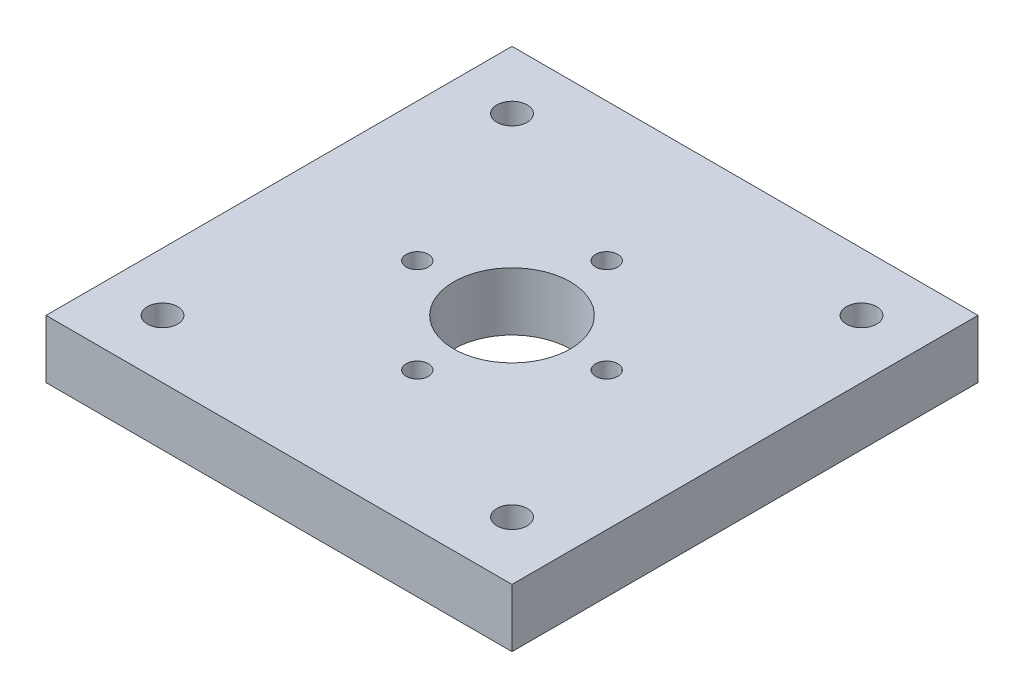
ISO-10303-21;
HEADER;
FILE_DESCRIPTION(('STEP AP214'),'2;1');
FILE_NAME('part.step','',(''),(''),'','','');
FILE_SCHEMA(('AUTOMOTIVE_DESIGN { 1 0 10303 214 1 1 1 1 }'));
ENDSEC;
DATA;
#1=APPLICATION_CONTEXT('core data for automotive mechanical design processes');
#2=APPLICATION_PROTOCOL_DEFINITION('international standard','automotive_design',2000,#1);
#3=PRODUCT_CONTEXT('',#1,'mechanical');
#4=PRODUCT('Part','Part','',(#3));
#5=PRODUCT_RELATED_PRODUCT_CATEGORY('part','',(#4));
#6=PRODUCT_DEFINITION_FORMATION('','',#4);
#7=PRODUCT_DEFINITION_CONTEXT('part definition',#1,'design');
#8=PRODUCT_DEFINITION('design','',#6,#7);
#9=PRODUCT_DEFINITION_SHAPE('','',#8);
#10=(LENGTH_UNIT() NAMED_UNIT(*) SI_UNIT(.MILLI.,.METRE.));
#11=(NAMED_UNIT(*) PLANE_ANGLE_UNIT() SI_UNIT($,.RADIAN.));
#12=(NAMED_UNIT(*) SI_UNIT($,.STERADIAN.) SOLID_ANGLE_UNIT());
#13=UNCERTAINTY_MEASURE_WITH_UNIT(LENGTH_MEASURE(1.E-05),#10,'distance_accuracy_value','');
#14=(GEOMETRIC_REPRESENTATION_CONTEXT(3) GLOBAL_UNCERTAINTY_ASSIGNED_CONTEXT((#13)) GLOBAL_UNIT_ASSIGNED_CONTEXT((#10,
#11,#12)) REPRESENTATION_CONTEXT('',''));
#15=CARTESIAN_POINT('',(0.,0.,0.));
#16=DIRECTION('',(0.,0.,1.));
#17=DIRECTION('',(1.,0.,0.));
#18=AXIS2_PLACEMENT_3D('',#15,#16,#17);
#19=CARTESIAN_POINT('',(2.,0.5,-2.));
#20=DIRECTION('',(-1.,0.,0.));
#21=DIRECTION('',(0.,0.,1.));
#22=AXIS2_PLACEMENT_3D('',#19,#20,#21);
#23=PLANE('',#22);
#24=DIRECTION('',(0.,0.,-1.));
#25=VECTOR('',#24,1.);
#26=CARTESIAN_POINT('',(2.,0.,-2.));
#27=LINE('',#26,#25);
#28=CARTESIAN_POINT('',(2.,0.,2.));
#29=VERTEX_POINT('',#28);
#30=CARTESIAN_POINT('',(2.,0.,-2.));
#31=VERTEX_POINT('',#30);
#32=EDGE_CURVE('E101',#29,#31,#27,.T.);
#33=ORIENTED_EDGE('',*,*,#32,.T.);
#34=DIRECTION('',(0.,-1.,0.));
#35=VECTOR('',#34,1.);
#36=CARTESIAN_POINT('',(2.,0.5,-2.));
#37=LINE('',#36,#35);
#38=CARTESIAN_POINT('',(2.,0.5,-2.));
#39=VERTEX_POINT('',#38);
#40=EDGE_CURVE('E11',#39,#31,#37,.T.);
#41=ORIENTED_EDGE('',*,*,#40,.F.);
#42=DIRECTION('',(0.,0.,-1.));
#43=VECTOR('',#42,1.);
#44=CARTESIAN_POINT('',(2.,0.5,-2.));
#45=LINE('',#44,#43);
#46=CARTESIAN_POINT('',(2.,0.5,2.));
#47=VERTEX_POINT('',#46);
#48=EDGE_CURVE('E89',#47,#39,#45,.T.);
#49=ORIENTED_EDGE('',*,*,#48,.F.);
#50=DIRECTION('',(0.,-1.,0.));
#51=VECTOR('',#50,1.);
#52=CARTESIAN_POINT('',(2.,0.5,2.));
#53=LINE('',#52,#51);
#54=EDGE_CURVE('E97',#47,#29,#53,.T.);
#55=ORIENTED_EDGE('',*,*,#54,.T.);
#56=EDGE_LOOP('',(#33,#41,#49,#55));
#57=FACE_BOUND('',#56,.T.);
#58=ADVANCED_FACE('F38',(#57),#23,.F.);
#59=CARTESIAN_POINT('',(-2.,0.5,-2.));
#60=DIRECTION('',(0.,0.,1.));
#61=DIRECTION('',(1.,0.,0.));
#62=AXIS2_PLACEMENT_3D('',#59,#60,#61);
#63=PLANE('',#62);
#64=DIRECTION('',(-1.,0.,0.));
#65=VECTOR('',#64,1.);
#66=CARTESIAN_POINT('',(-2.,0.,-2.));
#67=LINE('',#66,#65);
#68=CARTESIAN_POINT('',(-2.,0.,-2.));
#69=VERTEX_POINT('',#68);
#70=EDGE_CURVE('E93',#31,#69,#67,.T.);
#71=ORIENTED_EDGE('',*,*,#70,.T.);
#72=DIRECTION('',(0.,-1.,0.));
#73=VECTOR('',#72,1.);
#74=CARTESIAN_POINT('',(-2.,0.5,-2.));
#75=LINE('',#74,#73);
#76=CARTESIAN_POINT('',(-2.,0.5,-2.));
#77=VERTEX_POINT('',#76);
#78=EDGE_CURVE('E46',#77,#69,#75,.T.);
#79=ORIENTED_EDGE('',*,*,#78,.F.);
#80=DIRECTION('',(-1.,0.,0.));
#81=VECTOR('',#80,1.);
#82=CARTESIAN_POINT('',(-2.,0.5,-2.));
#83=LINE('',#82,#81);
#84=EDGE_CURVE('E84',#39,#77,#83,.T.);
#85=ORIENTED_EDGE('',*,*,#84,.F.);
#86=ORIENTED_EDGE('',*,*,#40,.T.);
#87=EDGE_LOOP('',(#71,#79,#85,#86));
#88=FACE_BOUND('',#87,.T.);
#89=ADVANCED_FACE('F92',(#88),#63,.F.);
#90=CARTESIAN_POINT('',(-2.,0.5,-2.));
#91=DIRECTION('',(1.,0.,0.));
#92=DIRECTION('',(0.,0.,-1.));
#93=AXIS2_PLACEMENT_3D('',#90,#91,#92);
#94=PLANE('',#93);
#95=DIRECTION('',(0.,0.,1.));
#96=VECTOR('',#95,1.);
#97=CARTESIAN_POINT('',(-2.,0.,-2.));
#98=LINE('',#97,#96);
#99=CARTESIAN_POINT('',(-2.,0.,2.));
#100=VERTEX_POINT('',#99);
#101=EDGE_CURVE('E71',#69,#100,#98,.T.);
#102=ORIENTED_EDGE('',*,*,#101,.T.);
#103=DIRECTION('',(0.,-1.,0.));
#104=VECTOR('',#103,1.);
#105=CARTESIAN_POINT('',(-2.,0.5,2.));
#106=LINE('',#105,#104);
#107=CARTESIAN_POINT('',(-2.,0.5,2.));
#108=VERTEX_POINT('',#107);
#109=EDGE_CURVE('E94',#108,#100,#106,.T.);
#110=ORIENTED_EDGE('',*,*,#109,.F.);
#111=DIRECTION('',(0.,0.,1.));
#112=VECTOR('',#111,1.);
#113=CARTESIAN_POINT('',(-2.,0.5,-2.));
#114=LINE('',#113,#112);
#115=EDGE_CURVE('E87',#77,#108,#114,.T.);
#116=ORIENTED_EDGE('',*,*,#115,.F.);
#117=ORIENTED_EDGE('',*,*,#78,.T.);
#118=EDGE_LOOP('',(#102,#110,#116,#117));
#119=FACE_BOUND('',#118,.T.);
#120=ADVANCED_FACE('F95',(#119),#94,.F.);
#121=CARTESIAN_POINT('',(-2.,0.5,2.));
#122=DIRECTION('',(0.,0.,-1.));
#123=DIRECTION('',(-1.,0.,0.));
#124=AXIS2_PLACEMENT_3D('',#121,#122,#123);
#125=PLANE('',#124);
#126=DIRECTION('',(1.,0.,0.));
#127=VECTOR('',#126,1.);
#128=CARTESIAN_POINT('',(-2.,0.,2.));
#129=LINE('',#128,#127);
#130=EDGE_CURVE('E77',#100,#29,#129,.T.);
#131=ORIENTED_EDGE('',*,*,#130,.T.);
#132=ORIENTED_EDGE('',*,*,#54,.F.);
#133=DIRECTION('',(1.,0.,0.));
#134=VECTOR('',#133,1.);
#135=CARTESIAN_POINT('',(-2.,0.5,2.));
#136=LINE('',#135,#134);
#137=EDGE_CURVE('E54',#108,#47,#136,.T.);
#138=ORIENTED_EDGE('',*,*,#137,.F.);
#139=ORIENTED_EDGE('',*,*,#109,.T.);
#140=EDGE_LOOP('',(#131,#132,#138,#139));
#141=FACE_BOUND('',#140,.T.);
#142=ADVANCED_FACE('F109',(#141),#125,.F.);
#143=CARTESIAN_POINT('',(0.,0.5,0.));
#144=DIRECTION('',(0.,1.,0.));
#145=DIRECTION('',(0.,0.,1.));
#146=AXIS2_PLACEMENT_3D('',#143,#144,#145);
#147=PLANE('',#146);
#148=CARTESIAN_POINT('',(-0.813,0.5,0.));
#149=DIRECTION('',(0.,-1.,0.));
#150=DIRECTION('',(1.,0.,0.));
#151=AXIS2_PLACEMENT_3D('',#148,#149,#150);
#152=CIRCLE('',#151,0.095);
#153=CARTESIAN_POINT('',(-0.718,0.5,0.));
#154=VERTEX_POINT('',#153);
#155=EDGE_CURVE('E161',#154,#154,#152,.T.);
#156=ORIENTED_EDGE('',*,*,#155,.T.);
#157=EDGE_LOOP('',(#156));
#158=FACE_BOUND('',#157,.T.);
#159=CARTESIAN_POINT('',(0.,0.5,-0.813));
#160=DIRECTION('',(0.,-1.,0.));
#161=DIRECTION('',(0.,0.,1.));
#162=AXIS2_PLACEMENT_3D('',#159,#160,#161);
#163=CIRCLE('',#162,0.095);
#164=CARTESIAN_POINT('',(0.,0.5,-0.718));
#165=VERTEX_POINT('',#164);
#166=EDGE_CURVE('E154',#165,#165,#163,.T.);
#167=ORIENTED_EDGE('',*,*,#166,.T.);
#168=EDGE_LOOP('',(#167));
#169=FACE_BOUND('',#168,.T.);
#170=CARTESIAN_POINT('',(0.813,0.5,0.));
#171=DIRECTION('',(0.,-1.,0.));
#172=DIRECTION('',(-1.,0.,0.));
#173=AXIS2_PLACEMENT_3D('',#170,#171,#172);
#174=CIRCLE('',#173,0.095);
#175=CARTESIAN_POINT('',(0.718,0.5,0.));
#176=VERTEX_POINT('',#175);
#177=EDGE_CURVE('E155',#176,#176,#174,.T.);
#178=ORIENTED_EDGE('',*,*,#177,.T.);
#179=EDGE_LOOP('',(#178));
#180=FACE_BOUND('',#179,.T.);
#181=CARTESIAN_POINT('',(0.,0.5,0.813));
#182=DIRECTION('',(0.,-1.,0.));
#183=DIRECTION('',(0.,0.,-1.));
#184=AXIS2_PLACEMENT_3D('',#181,#182,#183);
#185=CIRCLE('',#184,0.095);
#186=CARTESIAN_POINT('',(0.,0.5,0.718));
#187=VERTEX_POINT('',#186);
#188=EDGE_CURVE('E142',#187,#187,#185,.T.);
#189=ORIENTED_EDGE('',*,*,#188,.T.);
#190=EDGE_LOOP('',(#189));
#191=FACE_BOUND('',#190,.T.);
#192=CARTESIAN_POINT('',(0.,0.5,0.));
#193=DIRECTION('',(0.,-1.,0.));
#194=DIRECTION('',(0.,0.,-1.));
#195=AXIS2_PLACEMENT_3D('',#192,#193,#194);
#196=CIRCLE('',#195,0.5);
#197=CARTESIAN_POINT('',(0.,0.5,-0.5));
#198=VERTEX_POINT('',#197);
#199=EDGE_CURVE('E125',#198,#198,#196,.T.);
#200=ORIENTED_EDGE('',*,*,#199,.T.);
#201=EDGE_LOOP('',(#200));
#202=FACE_BOUND('',#201,.T.);
#203=CARTESIAN_POINT('',(-1.5,0.5,-1.5));
#204=DIRECTION('',(0.,1.,0.));
#205=DIRECTION('',(0.,0.,-1.));
#206=AXIS2_PLACEMENT_3D('',#203,#204,#205);
#207=CIRCLE('',#206,0.13);
#208=CARTESIAN_POINT('',(-1.5,0.5,-1.63));
#209=VERTEX_POINT('',#208);
#210=EDGE_CURVE('E121',#209,#209,#207,.T.);
#211=ORIENTED_EDGE('',*,*,#210,.F.);
#212=EDGE_LOOP('',(#211));
#213=FACE_BOUND('',#212,.T.);
#214=CARTESIAN_POINT('',(1.5,0.5,-1.5));
#215=DIRECTION('',(0.,1.,0.));
#216=DIRECTION('',(0.,0.,-1.));
#217=AXIS2_PLACEMENT_3D('',#214,#215,#216);
#218=CIRCLE('',#217,0.13);
#219=CARTESIAN_POINT('',(1.5,0.5,-1.63));
#220=VERTEX_POINT('',#219);
#221=EDGE_CURVE('E128',#220,#220,#218,.T.);
#222=ORIENTED_EDGE('',*,*,#221,.F.);
#223=EDGE_LOOP('',(#222));
#224=FACE_BOUND('',#223,.T.);
#225=CARTESIAN_POINT('',(1.5,0.5,1.5));
#226=DIRECTION('',(0.,1.,0.));
#227=DIRECTION('',(0.,0.,1.));
#228=AXIS2_PLACEMENT_3D('',#225,#226,#227);
#229=CIRCLE('',#228,0.13);
#230=CARTESIAN_POINT('',(1.5,0.5,1.63));
#231=VERTEX_POINT('',#230);
#232=EDGE_CURVE('E134',#231,#231,#229,.T.);
#233=ORIENTED_EDGE('',*,*,#232,.F.);
#234=EDGE_LOOP('',(#233));
#235=FACE_BOUND('',#234,.T.);
#236=CARTESIAN_POINT('',(-1.5,0.5,1.5));
#237=DIRECTION('',(0.,1.,0.));
#238=DIRECTION('',(0.,0.,1.));
#239=AXIS2_PLACEMENT_3D('',#236,#237,#238);
#240=CIRCLE('',#239,0.13);
#241=CARTESIAN_POINT('',(-1.5,0.5,1.63));
#242=VERTEX_POINT('',#241);
#243=EDGE_CURVE('E115',#242,#242,#240,.T.);
#244=ORIENTED_EDGE('',*,*,#243,.F.);
#245=EDGE_LOOP('',(#244));
#246=FACE_BOUND('',#245,.T.);
#247=ORIENTED_EDGE('',*,*,#48,.T.);
#248=ORIENTED_EDGE('',*,*,#84,.T.);
#249=ORIENTED_EDGE('',*,*,#115,.T.);
#250=ORIENTED_EDGE('',*,*,#137,.T.);
#251=EDGE_LOOP('',(#247,#248,#249,#250));
#252=FACE_BOUND('',#251,.T.);
#253=ADVANCED_FACE('F85',(#158,#169,#180,#191,#202,#213,#224,#235,#246,#252),#147,.T.);
#254=CARTESIAN_POINT('',(0.,0.,0.));
#255=DIRECTION('',(0.,1.,0.));
#256=DIRECTION('',(0.,0.,1.));
#257=AXIS2_PLACEMENT_3D('',#254,#255,#256);
#258=PLANE('',#257);
#259=CARTESIAN_POINT('',(-0.813,0.,0.));
#260=DIRECTION('',(0.,-1.,0.));
#261=DIRECTION('',(1.,0.,0.));
#262=AXIS2_PLACEMENT_3D('',#259,#260,#261);
#263=CIRCLE('',#262,0.095);
#264=CARTESIAN_POINT('',(-0.718,0.,0.));
#265=VERTEX_POINT('',#264);
#266=EDGE_CURVE('E148',#265,#265,#263,.T.);
#267=ORIENTED_EDGE('',*,*,#266,.F.);
#268=EDGE_LOOP('',(#267));
#269=FACE_BOUND('',#268,.T.);
#270=CARTESIAN_POINT('',(0.,0.,-0.813));
#271=DIRECTION('',(0.,-1.,0.));
#272=DIRECTION('',(0.,0.,1.));
#273=AXIS2_PLACEMENT_3D('',#270,#271,#272);
#274=CIRCLE('',#273,0.095);
#275=CARTESIAN_POINT('',(0.,0.,-0.718));
#276=VERTEX_POINT('',#275);
#277=EDGE_CURVE('E158',#276,#276,#274,.T.);
#278=ORIENTED_EDGE('',*,*,#277,.F.);
#279=EDGE_LOOP('',(#278));
#280=FACE_BOUND('',#279,.T.);
#281=CARTESIAN_POINT('',(0.813,0.,0.));
#282=DIRECTION('',(0.,-1.,0.));
#283=DIRECTION('',(-1.,0.,0.));
#284=AXIS2_PLACEMENT_3D('',#281,#282,#283);
#285=CIRCLE('',#284,0.095);
#286=CARTESIAN_POINT('',(0.718,0.,0.));
#287=VERTEX_POINT('',#286);
#288=EDGE_CURVE('E151',#287,#287,#285,.T.);
#289=ORIENTED_EDGE('',*,*,#288,.F.);
#290=EDGE_LOOP('',(#289));
#291=FACE_BOUND('',#290,.T.);
#292=CARTESIAN_POINT('',(0.,0.,0.813));
#293=DIRECTION('',(0.,-1.,0.));
#294=DIRECTION('',(0.,0.,-1.));
#295=AXIS2_PLACEMENT_3D('',#292,#293,#294);
#296=CIRCLE('',#295,0.095);
#297=CARTESIAN_POINT('',(0.,0.,0.718));
#298=VERTEX_POINT('',#297);
#299=EDGE_CURVE('E145',#298,#298,#296,.T.);
#300=ORIENTED_EDGE('',*,*,#299,.F.);
#301=EDGE_LOOP('',(#300));
#302=FACE_BOUND('',#301,.T.);
#303=CARTESIAN_POINT('',(0.,0.,0.));
#304=DIRECTION('',(0.,-1.,0.));
#305=DIRECTION('',(0.,0.,-1.));
#306=AXIS2_PLACEMENT_3D('',#303,#304,#305);
#307=CIRCLE('',#306,0.5);
#308=CARTESIAN_POINT('',(0.,0.,-0.5));
#309=VERTEX_POINT('',#308);
#310=EDGE_CURVE('E139',#309,#309,#307,.T.);
#311=ORIENTED_EDGE('',*,*,#310,.F.);
#312=EDGE_LOOP('',(#311));
#313=FACE_BOUND('',#312,.T.);
#314=CARTESIAN_POINT('',(-1.5,0.,-1.5));
#315=DIRECTION('',(0.,1.,0.));
#316=DIRECTION('',(0.,0.,-1.));
#317=AXIS2_PLACEMENT_3D('',#314,#315,#316);
#318=CIRCLE('',#317,0.13);
#319=CARTESIAN_POINT('',(-1.5,0.,-1.63));
#320=VERTEX_POINT('',#319);
#321=EDGE_CURVE('E124',#320,#320,#318,.T.);
#322=ORIENTED_EDGE('',*,*,#321,.T.);
#323=EDGE_LOOP('',(#322));
#324=FACE_BOUND('',#323,.T.);
#325=CARTESIAN_POINT('',(1.5,0.,-1.5));
#326=DIRECTION('',(0.,1.,0.));
#327=DIRECTION('',(0.,0.,-1.));
#328=AXIS2_PLACEMENT_3D('',#325,#326,#327);
#329=CIRCLE('',#328,0.13);
#330=CARTESIAN_POINT('',(1.5,0.,-1.63));
#331=VERTEX_POINT('',#330);
#332=EDGE_CURVE('E131',#331,#331,#329,.T.);
#333=ORIENTED_EDGE('',*,*,#332,.T.);
#334=EDGE_LOOP('',(#333));
#335=FACE_BOUND('',#334,.T.);
#336=CARTESIAN_POINT('',(1.5,0.,1.5));
#337=DIRECTION('',(0.,1.,0.));
#338=DIRECTION('',(0.,0.,1.));
#339=AXIS2_PLACEMENT_3D('',#336,#337,#338);
#340=CIRCLE('',#339,0.13);
#341=CARTESIAN_POINT('',(1.5,0.,1.63));
#342=VERTEX_POINT('',#341);
#343=EDGE_CURVE('E118',#342,#342,#340,.T.);
#344=ORIENTED_EDGE('',*,*,#343,.T.);
#345=EDGE_LOOP('',(#344));
#346=FACE_BOUND('',#345,.T.);
#347=CARTESIAN_POINT('',(-1.5,0.,1.5));
#348=DIRECTION('',(0.,1.,0.));
#349=DIRECTION('',(0.,0.,1.));
#350=AXIS2_PLACEMENT_3D('',#347,#348,#349);
#351=CIRCLE('',#350,0.13);
#352=CARTESIAN_POINT('',(-1.5,0.,1.63));
#353=VERTEX_POINT('',#352);
#354=EDGE_CURVE('E104',#353,#353,#351,.T.);
#355=ORIENTED_EDGE('',*,*,#354,.T.);
#356=EDGE_LOOP('',(#355));
#357=FACE_BOUND('',#356,.T.);
#358=ORIENTED_EDGE('',*,*,#32,.F.);
#359=ORIENTED_EDGE('',*,*,#130,.F.);
#360=ORIENTED_EDGE('',*,*,#101,.F.);
#361=ORIENTED_EDGE('',*,*,#70,.F.);
#362=EDGE_LOOP('',(#358,#359,#360,#361));
#363=FACE_BOUND('',#362,.T.);
#364=ADVANCED_FACE('F112',(#269,#280,#291,#302,#313,#324,#335,#346,#357,#363),#258,.F.);
#365=CARTESIAN_POINT('',(-1.5,0.,1.5));
#366=DIRECTION('',(0.,1.,0.));
#367=DIRECTION('',(0.,0.,1.));
#368=AXIS2_PLACEMENT_3D('',#365,#366,#367);
#369=CYLINDRICAL_SURFACE('',#368,0.13);
#370=ORIENTED_EDGE('',*,*,#354,.F.);
#371=EDGE_LOOP('',(#370));
#372=FACE_BOUND('',#371,.T.);
#373=ORIENTED_EDGE('',*,*,#243,.T.);
#374=EDGE_LOOP('',(#373));
#375=FACE_BOUND('',#374,.T.);
#376=ADVANCED_FACE('F180',(#372,#375),#369,.F.);
#377=CARTESIAN_POINT('',(1.5,0.,1.5));
#378=DIRECTION('',(0.,1.,0.));
#379=DIRECTION('',(0.,0.,1.));
#380=AXIS2_PLACEMENT_3D('',#377,#378,#379);
#381=CYLINDRICAL_SURFACE('',#380,0.13);
#382=ORIENTED_EDGE('',*,*,#343,.F.);
#383=EDGE_LOOP('',(#382));
#384=FACE_BOUND('',#383,.T.);
#385=ORIENTED_EDGE('',*,*,#232,.T.);
#386=EDGE_LOOP('',(#385));
#387=FACE_BOUND('',#386,.T.);
#388=ADVANCED_FACE('F200',(#384,#387),#381,.F.);
#389=CARTESIAN_POINT('',(1.5,0.,-1.5));
#390=DIRECTION('',(0.,1.,0.));
#391=DIRECTION('',(0.,0.,1.));
#392=AXIS2_PLACEMENT_3D('',#389,#390,#391);
#393=CYLINDRICAL_SURFACE('',#392,0.13);
#394=ORIENTED_EDGE('',*,*,#332,.F.);
#395=EDGE_LOOP('',(#394));
#396=FACE_BOUND('',#395,.T.);
#397=ORIENTED_EDGE('',*,*,#221,.T.);
#398=EDGE_LOOP('',(#397));
#399=FACE_BOUND('',#398,.T.);
#400=ADVANCED_FACE('F246',(#396,#399),#393,.F.);
#401=CARTESIAN_POINT('',(-1.5,0.,-1.5));
#402=DIRECTION('',(0.,1.,0.));
#403=DIRECTION('',(0.,0.,1.));
#404=AXIS2_PLACEMENT_3D('',#401,#402,#403);
#405=CYLINDRICAL_SURFACE('',#404,0.13);
#406=ORIENTED_EDGE('',*,*,#321,.F.);
#407=EDGE_LOOP('',(#406));
#408=FACE_BOUND('',#407,.T.);
#409=ORIENTED_EDGE('',*,*,#210,.T.);
#410=EDGE_LOOP('',(#409));
#411=FACE_BOUND('',#410,.T.);
#412=ADVANCED_FACE('F254',(#408,#411),#405,.F.);
#413=CARTESIAN_POINT('',(0.,0.5,0.));
#414=DIRECTION('',(0.,-1.,0.));
#415=DIRECTION('',(0.,0.,-1.));
#416=AXIS2_PLACEMENT_3D('',#413,#414,#415);
#417=CYLINDRICAL_SURFACE('',#416,0.5);
#418=ORIENTED_EDGE('',*,*,#199,.F.);
#419=EDGE_LOOP('',(#418));
#420=FACE_BOUND('',#419,.T.);
#421=ORIENTED_EDGE('',*,*,#310,.T.);
#422=EDGE_LOOP('',(#421));
#423=FACE_BOUND('',#422,.T.);
#424=ADVANCED_FACE('F262',(#420,#423),#417,.F.);
#425=CARTESIAN_POINT('',(0.,0.5,0.813));
#426=DIRECTION('',(0.,-1.,0.));
#427=DIRECTION('',(0.,0.,-1.));
#428=AXIS2_PLACEMENT_3D('',#425,#426,#427);
#429=CYLINDRICAL_SURFACE('',#428,0.095);
#430=ORIENTED_EDGE('',*,*,#188,.F.);
#431=EDGE_LOOP('',(#430));
#432=FACE_BOUND('',#431,.T.);
#433=ORIENTED_EDGE('',*,*,#299,.T.);
#434=EDGE_LOOP('',(#433));
#435=FACE_BOUND('',#434,.T.);
#436=ADVANCED_FACE('F270',(#432,#435),#429,.F.);
#437=CARTESIAN_POINT('',(0.813,0.5,0.));
#438=DIRECTION('',(0.,-1.,0.));
#439=DIRECTION('',(-1.,0.,0.));
#440=AXIS2_PLACEMENT_3D('',#437,#438,#439);
#441=CYLINDRICAL_SURFACE('',#440,0.095);
#442=ORIENTED_EDGE('',*,*,#177,.F.);
#443=EDGE_LOOP('',(#442));
#444=FACE_BOUND('',#443,.T.);
#445=ORIENTED_EDGE('',*,*,#288,.T.);
#446=EDGE_LOOP('',(#445));
#447=FACE_BOUND('',#446,.T.);
#448=ADVANCED_FACE('F277',(#444,#447),#441,.F.);
#449=CARTESIAN_POINT('',(0.,0.5,-0.813));
#450=DIRECTION('',(0.,-1.,0.));
#451=DIRECTION('',(0.,0.,1.));
#452=AXIS2_PLACEMENT_3D('',#449,#450,#451);
#453=CYLINDRICAL_SURFACE('',#452,0.095);
#454=ORIENTED_EDGE('',*,*,#166,.F.);
#455=EDGE_LOOP('',(#454));
#456=FACE_BOUND('',#455,.T.);
#457=ORIENTED_EDGE('',*,*,#277,.T.);
#458=EDGE_LOOP('',(#457));
#459=FACE_BOUND('',#458,.T.);
#460=ADVANCED_FACE('F174',(#456,#459),#453,.F.);
#461=CARTESIAN_POINT('',(-0.813,0.5,0.));
#462=DIRECTION('',(0.,-1.,0.));
#463=DIRECTION('',(1.,0.,0.));
#464=AXIS2_PLACEMENT_3D('',#461,#462,#463);
#465=CYLINDRICAL_SURFACE('',#464,0.095);
#466=ORIENTED_EDGE('',*,*,#155,.F.);
#467=EDGE_LOOP('',(#466));
#468=FACE_BOUND('',#467,.T.);
#469=ORIENTED_EDGE('',*,*,#266,.T.);
#470=EDGE_LOOP('',(#469));
#471=FACE_BOUND('',#470,.T.);
#472=ADVANCED_FACE('F171',(#468,#471),#465,.F.);
#473=CLOSED_SHELL('',(#58,#89,#120,#142,#253,#364,#376,#388,#400,#412,#424,#436,#448,#460,#472));
#474=MANIFOLD_SOLID_BREP('B2',#473);
#475=ADVANCED_BREP_SHAPE_REPRESENTATION('',(#18,#474),#14);
#476=SHAPE_DEFINITION_REPRESENTATION(#9,#475);
ENDSEC;
END-ISO-10303-21;
